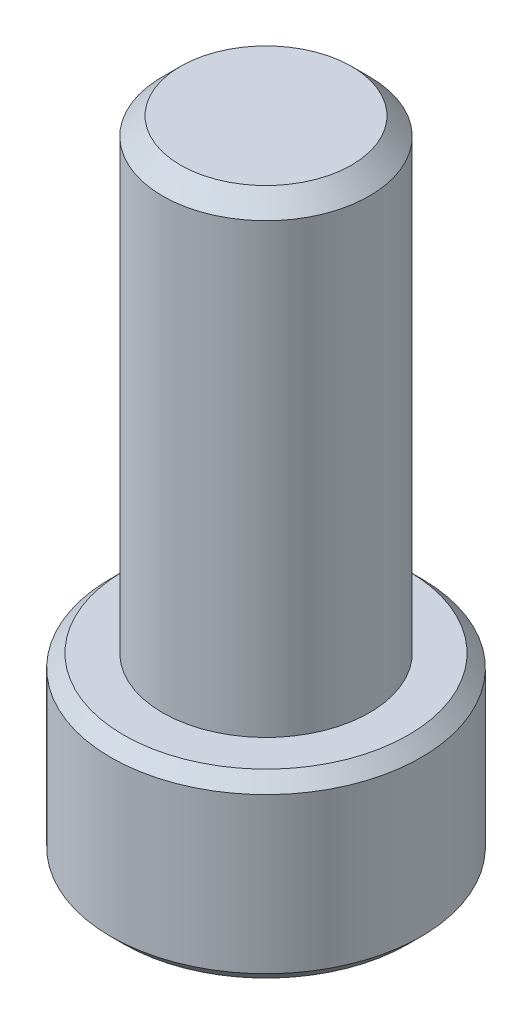
ISO-10303-21;
HEADER;
FILE_DESCRIPTION(('STEP AP214'),'2;1');
FILE_NAME('part.step','',(''),(''),'','','');
FILE_SCHEMA(('AUTOMOTIVE_DESIGN { 1 0 10303 214 1 1 1 1 }'));
ENDSEC;
DATA;
#1=APPLICATION_CONTEXT('core data for automotive mechanical design processes');
#2=APPLICATION_PROTOCOL_DEFINITION('international standard','automotive_design',2000,#1);
#3=PRODUCT_CONTEXT('',#1,'mechanical');
#4=PRODUCT('Part','Part','',(#3));
#5=PRODUCT_RELATED_PRODUCT_CATEGORY('part','',(#4));
#6=PRODUCT_DEFINITION_FORMATION('','',#4);
#7=PRODUCT_DEFINITION_CONTEXT('part definition',#1,'design');
#8=PRODUCT_DEFINITION('design','',#6,#7);
#9=PRODUCT_DEFINITION_SHAPE('','',#8);
#10=(LENGTH_UNIT() NAMED_UNIT(*) SI_UNIT(.MILLI.,.METRE.));
#11=(NAMED_UNIT(*) PLANE_ANGLE_UNIT() SI_UNIT($,.RADIAN.));
#12=(NAMED_UNIT(*) SI_UNIT($,.STERADIAN.) SOLID_ANGLE_UNIT());
#13=UNCERTAINTY_MEASURE_WITH_UNIT(LENGTH_MEASURE(1.E-05),#10,'distance_accuracy_value','');
#14=(GEOMETRIC_REPRESENTATION_CONTEXT(3) GLOBAL_UNCERTAINTY_ASSIGNED_CONTEXT((#13)) GLOBAL_UNIT_ASSIGNED_CONTEXT((#10,
#11,#12)) REPRESENTATION_CONTEXT('',''));
#15=CARTESIAN_POINT('',(0.,0.,0.));
#16=DIRECTION('',(0.,0.,1.));
#17=DIRECTION('',(1.,0.,0.));
#18=AXIS2_PLACEMENT_3D('',#15,#16,#17);
#19=CARTESIAN_POINT('',(0.,0.,0.));
#20=DIRECTION('',(0.,1.,0.));
#21=DIRECTION('',(0.,0.,1.));
#22=AXIS2_PLACEMENT_3D('',#19,#20,#21);
#23=PLANE('',#22);
#24=DIRECTION('',(0.,0.,-1.));
#25=VECTOR('',#24,1.);
#26=CARTESIAN_POINT('',(2.84807621135332,0.,-1.5));
#27=LINE('',#26,#25);
#28=CARTESIAN_POINT('',(2.84807621135332,0.,1.64433756729741));
#29=VERTEX_POINT('',#28);
#30=CARTESIAN_POINT('',(2.84807621135332,0.,-1.64433756729741));
#31=VERTEX_POINT('',#30);
#32=EDGE_CURVE('E234',#29,#31,#27,.T.);
#33=ORIENTED_EDGE('',*,*,#32,.T.);
#34=DIRECTION('',(-0.866025403784439,0.,-0.5));
#35=VECTOR('',#34,1.);
#36=CARTESIAN_POINT('',(0.125000000000001,0.,-3.21650635094611));
#37=LINE('',#36,#35);
#38=CARTESIAN_POINT('',(0.,0.,-3.28867513459481));
#39=VERTEX_POINT('',#38);
#40=EDGE_CURVE('E149',#31,#39,#37,.T.);
#41=ORIENTED_EDGE('',*,*,#40,.T.);
#42=DIRECTION('',(-0.866025403784439,0.,0.5));
#43=VECTOR('',#42,1.);
#44=CARTESIAN_POINT('',(-2.72307621135332,0.,-1.71650635094611));
#45=LINE('',#44,#43);
#46=CARTESIAN_POINT('',(-2.84807621135332,0.,-1.64433756729741));
#47=VERTEX_POINT('',#46);
#48=EDGE_CURVE('E178',#39,#47,#45,.T.);
#49=ORIENTED_EDGE('',*,*,#48,.T.);
#50=DIRECTION('',(0.,0.,1.));
#51=VECTOR('',#50,1.);
#52=CARTESIAN_POINT('',(-2.84807621135332,0.,1.5));
#53=LINE('',#52,#51);
#54=CARTESIAN_POINT('',(-2.84807621135332,0.,1.64433756729741));
#55=VERTEX_POINT('',#54);
#56=EDGE_CURVE('E225',#47,#55,#53,.T.);
#57=ORIENTED_EDGE('',*,*,#56,.T.);
#58=DIRECTION('',(0.866025403784439,0.,0.5));
#59=VECTOR('',#58,1.);
#60=CARTESIAN_POINT('',(-0.125000000000001,0.,3.21650635094611));
#61=LINE('',#60,#59);
#62=CARTESIAN_POINT('',(0.,0.,3.28867513459481));
#63=VERTEX_POINT('',#62);
#64=EDGE_CURVE('E228',#55,#63,#61,.T.);
#65=ORIENTED_EDGE('',*,*,#64,.T.);
#66=DIRECTION('',(0.866025403784439,0.,-0.5));
#67=VECTOR('',#66,1.);
#68=CARTESIAN_POINT('',(2.72307621135332,0.,1.71650635094611));
#69=LINE('',#68,#67);
#70=EDGE_CURVE('E231',#63,#29,#69,.T.);
#71=ORIENTED_EDGE('',*,*,#70,.T.);
#72=EDGE_LOOP('',(#33,#41,#49,#57,#65,#71));
#73=FACE_BOUND('',#72,.T.);
#74=CARTESIAN_POINT('',(0.,0.,0.));
#75=DIRECTION('',(0.,1.,0.));
#76=DIRECTION('',(0.,0.,1.));
#77=AXIS2_PLACEMENT_3D('',#74,#75,#76);
#78=CIRCLE('',#77,5.5);
#79=CARTESIAN_POINT('',(0.,0.,5.5));
#80=VERTEX_POINT('',#79);
#81=EDGE_CURVE('E217',#80,#80,#78,.F.);
#82=ORIENTED_EDGE('',*,*,#81,.T.);
#83=EDGE_LOOP('',(#82));
#84=FACE_BOUND('',#83,.T.);
#85=ADVANCED_FACE('F51',(#73,#84),#23,.F.);
#86=CARTESIAN_POINT('',(0.,25.,0.));
#87=DIRECTION('',(0.,-1.,0.));
#88=DIRECTION('',(0.,0.,-1.));
#89=AXIS2_PLACEMENT_3D('',#86,#87,#88);
#90=CYLINDRICAL_SURFACE('',#89,6.);
#91=CARTESIAN_POINT('',(0.,6.5,0.));
#92=DIRECTION('',(0.,-1.,0.));
#93=DIRECTION('',(0.,0.,-1.));
#94=AXIS2_PLACEMENT_3D('',#91,#92,#93);
#95=CIRCLE('',#94,6.);
#96=CARTESIAN_POINT('',(0.,6.5,-6.));
#97=VERTEX_POINT('',#96);
#98=EDGE_CURVE('E209',#97,#97,#95,.T.);
#99=ORIENTED_EDGE('',*,*,#98,.T.);
#100=EDGE_LOOP('',(#99));
#101=FACE_BOUND('',#100,.T.);
#102=CARTESIAN_POINT('',(0.,0.5,0.));
#103=DIRECTION('',(0.,1.,0.));
#104=DIRECTION('',(0.,0.,1.));
#105=AXIS2_PLACEMENT_3D('',#102,#103,#104);
#106=CIRCLE('',#105,6.);
#107=CARTESIAN_POINT('',(0.,0.5,6.));
#108=VERTEX_POINT('',#107);
#109=EDGE_CURVE('E205',#108,#108,#106,.T.);
#110=ORIENTED_EDGE('',*,*,#109,.T.);
#111=EDGE_LOOP('',(#110));
#112=FACE_BOUND('',#111,.T.);
#113=ADVANCED_FACE('F385',(#101,#112),#90,.T.);
#114=CARTESIAN_POINT('',(0.,25.,0.));
#115=DIRECTION('',(0.,-1.,0.));
#116=DIRECTION('',(0.,0.,-1.));
#117=AXIS2_PLACEMENT_3D('',#114,#115,#116);
#118=CYLINDRICAL_SURFACE('',#117,4.);
#119=CARTESIAN_POINT('',(0.,7.,0.));
#120=DIRECTION('',(0.,-1.,0.));
#121=DIRECTION('',(0.,0.,-1.));
#122=AXIS2_PLACEMENT_3D('',#119,#120,#121);
#123=CIRCLE('',#122,4.);
#124=CARTESIAN_POINT('',(0.,7.,-4.));
#125=VERTEX_POINT('',#124);
#126=EDGE_CURVE('E201',#125,#125,#123,.T.);
#127=ORIENTED_EDGE('',*,*,#126,.F.);
#128=EDGE_LOOP('',(#127));
#129=FACE_BOUND('',#128,.T.);
#130=CARTESIAN_POINT('',(0.,24.3095,0.));
#131=DIRECTION('',(0.,-1.,0.));
#132=DIRECTION('',(0.,0.,-1.));
#133=AXIS2_PLACEMENT_3D('',#130,#131,#132);
#134=CIRCLE('',#133,3.99999999999999);
#135=CARTESIAN_POINT('',(0.,24.3095,-3.99999999999999));
#136=VERTEX_POINT('',#135);
#137=EDGE_CURVE('E188',#136,#136,#134,.T.);
#138=ORIENTED_EDGE('',*,*,#137,.T.);
#139=EDGE_LOOP('',(#138));
#140=FACE_BOUND('',#139,.T.);
#141=ADVANCED_FACE('F392',(#129,#140),#118,.T.);
#142=CARTESIAN_POINT('',(4.,7.,0.));
#143=DIRECTION('',(0.,-1.,0.));
#144=DIRECTION('',(0.,0.,-1.));
#145=AXIS2_PLACEMENT_3D('',#142,#143,#144);
#146=PLANE('',#145);
#147=CARTESIAN_POINT('',(0.,7.,0.));
#148=DIRECTION('',(0.,-1.,0.));
#149=DIRECTION('',(0.,0.,-1.));
#150=AXIS2_PLACEMENT_3D('',#147,#148,#149);
#151=CIRCLE('',#150,5.5);
#152=CARTESIAN_POINT('',(0.,7.,-5.5));
#153=VERTEX_POINT('',#152);
#154=EDGE_CURVE('E213',#153,#153,#151,.F.);
#155=ORIENTED_EDGE('',*,*,#154,.T.);
#156=EDGE_LOOP('',(#155));
#157=FACE_BOUND('',#156,.T.);
#158=ORIENTED_EDGE('',*,*,#126,.T.);
#159=EDGE_LOOP('',(#158));
#160=FACE_BOUND('',#159,.T.);
#161=ADVANCED_FACE('F578',(#157,#160),#146,.F.);
#162=CARTESIAN_POINT('',(0.,25.,0.));
#163=DIRECTION('',(0.,-1.,0.));
#164=DIRECTION('',(0.,0.,-1.));
#165=AXIS2_PLACEMENT_3D('',#162,#163,#164);
#166=CONICAL_SURFACE('',#165,3.3095,0.785398163397455);
#167=ORIENTED_EDGE('',*,*,#137,.F.);
#168=EDGE_LOOP('',(#167));
#169=FACE_BOUND('',#168,.T.);
#170=CARTESIAN_POINT('',(0.,25.,0.));
#171=DIRECTION('',(0.,-1.,0.));
#172=DIRECTION('',(0.,0.,-1.));
#173=AXIS2_PLACEMENT_3D('',#170,#171,#172);
#174=CIRCLE('',#173,3.3095);
#175=CARTESIAN_POINT('',(0.,25.,-3.3095));
#176=VERTEX_POINT('',#175);
#177=EDGE_CURVE('E197',#176,#176,#174,.T.);
#178=ORIENTED_EDGE('',*,*,#177,.T.);
#179=EDGE_LOOP('',(#178));
#180=FACE_BOUND('',#179,.T.);
#181=ADVANCED_FACE('F572',(#169,#180),#166,.T.);
#182=CARTESIAN_POINT('',(0.,25.,0.));
#183=DIRECTION('',(0.,1.,0.));
#184=DIRECTION('',(0.,0.,1.));
#185=AXIS2_PLACEMENT_3D('',#182,#183,#184);
#186=PLANE('',#185);
#187=ORIENTED_EDGE('',*,*,#177,.F.);
#188=EDGE_LOOP('',(#187));
#189=FACE_BOUND('',#188,.T.);
#190=ADVANCED_FACE('F396',(#189),#186,.T.);
#191=CARTESIAN_POINT('',(0.,6.5,0.));
#192=DIRECTION('',(0.,-1.,0.));
#193=DIRECTION('',(0.,0.,-1.));
#194=AXIS2_PLACEMENT_3D('',#191,#192,#193);
#195=CONICAL_SURFACE('',#194,6.,0.785398163397447);
#196=ORIENTED_EDGE('',*,*,#154,.F.);
#197=EDGE_LOOP('',(#196));
#198=FACE_BOUND('',#197,.T.);
#199=ORIENTED_EDGE('',*,*,#98,.F.);
#200=EDGE_LOOP('',(#199));
#201=FACE_BOUND('',#200,.T.);
#202=ADVANCED_FACE('F400',(#198,#201),#195,.T.);
#203=CARTESIAN_POINT('',(0.,0.5,0.));
#204=DIRECTION('',(0.,1.,0.));
#205=DIRECTION('',(0.,0.,1.));
#206=AXIS2_PLACEMENT_3D('',#203,#204,#205);
#207=CONICAL_SURFACE('',#206,6.,0.78539816339745);
#208=ORIENTED_EDGE('',*,*,#81,.F.);
#209=EDGE_LOOP('',(#208));
#210=FACE_BOUND('',#209,.T.);
#211=ORIENTED_EDGE('',*,*,#109,.F.);
#212=EDGE_LOOP('',(#211));
#213=FACE_BOUND('',#212,.T.);
#214=ADVANCED_FACE('F406',(#210,#213),#207,.T.);
#215=CARTESIAN_POINT('',(-2.59807621135332,-1.2E-05,-1.5));
#216=DIRECTION('',(0.5,0.,0.866025403784439));
#217=DIRECTION('',(0.866025403784439,0.,-0.5));
#218=AXIS2_PLACEMENT_3D('',#215,#216,#217);
#219=PLANE('',#218);
#220=DIRECTION('',(0.,1.,0.));
#221=VECTOR('',#220,1.);
#222=CARTESIAN_POINT('',(-2.59807621135332,-1.2E-05,-1.5));
#223=LINE('',#222,#221);
#224=CARTESIAN_POINT('',(-2.59807621135332,0.25,-1.5));
#225=VERTEX_POINT('',#224);
#226=CARTESIAN_POINT('',(-2.59807621135332,2.25,-1.5));
#227=VERTEX_POINT('',#226);
#228=EDGE_CURVE('E294',#225,#227,#223,.T.);
#229=ORIENTED_EDGE('',*,*,#228,.F.);
#230=DIRECTION('',(0.866025403784439,0.,-0.5));
#231=VECTOR('',#230,1.);
#232=CARTESIAN_POINT('',(0.,0.25,-3.));
#233=LINE('',#232,#231);
#234=CARTESIAN_POINT('',(0.,0.25,-3.));
#235=VERTEX_POINT('',#234);
#236=EDGE_CURVE('E262',#225,#235,#233,.T.);
#237=ORIENTED_EDGE('',*,*,#236,.T.);
#238=DIRECTION('',(0.,1.,0.));
#239=VECTOR('',#238,1.);
#240=CARTESIAN_POINT('',(0.,-1.2E-05,-3.));
#241=LINE('',#240,#239);
#242=CARTESIAN_POINT('',(0.,2.25,-3.));
#243=VERTEX_POINT('',#242);
#244=EDGE_CURVE('E175',#235,#243,#241,.T.);
#245=ORIENTED_EDGE('',*,*,#244,.T.);
#246=DIRECTION('',(-0.866025403784439,0.,0.5));
#247=VECTOR('',#246,1.);
#248=CARTESIAN_POINT('',(-2.59807621135332,2.25,-1.5));
#249=LINE('',#248,#247);
#250=EDGE_CURVE('E259',#243,#227,#249,.T.);
#251=ORIENTED_EDGE('',*,*,#250,.T.);
#252=EDGE_LOOP('',(#229,#237,#245,#251));
#253=FACE_BOUND('',#252,.T.);
#254=ADVANCED_FACE('F327',(#253),#219,.T.);
#255=CARTESIAN_POINT('',(0.,-1.2E-05,-3.));
#256=DIRECTION('',(-0.5,0.,0.866025403784438));
#257=DIRECTION('',(0.866025403784438,0.,0.5));
#258=AXIS2_PLACEMENT_3D('',#255,#256,#257);
#259=PLANE('',#258);
#260=ORIENTED_EDGE('',*,*,#244,.F.);
#261=DIRECTION('',(0.866025403784438,0.,0.5));
#262=VECTOR('',#261,1.);
#263=CARTESIAN_POINT('',(2.59807621135332,0.25,-1.5));
#264=LINE('',#263,#262);
#265=CARTESIAN_POINT('',(2.59807621135332,0.25,-1.5));
#266=VERTEX_POINT('',#265);
#267=EDGE_CURVE('E147',#235,#266,#264,.T.);
#268=ORIENTED_EDGE('',*,*,#267,.T.);
#269=DIRECTION('',(0.,1.,0.));
#270=VECTOR('',#269,1.);
#271=CARTESIAN_POINT('',(2.59807621135332,-1.2E-05,-1.5));
#272=LINE('',#271,#270);
#273=CARTESIAN_POINT('',(2.59807621135332,2.25,-1.5));
#274=VERTEX_POINT('',#273);
#275=EDGE_CURVE('E172',#266,#274,#272,.T.);
#276=ORIENTED_EDGE('',*,*,#275,.T.);
#277=DIRECTION('',(-0.866025403784438,0.,-0.5));
#278=VECTOR('',#277,1.);
#279=CARTESIAN_POINT('',(0.,2.25,-3.));
#280=LINE('',#279,#278);
#281=EDGE_CURVE('E179',#274,#243,#280,.T.);
#282=ORIENTED_EDGE('',*,*,#281,.T.);
#283=EDGE_LOOP('',(#260,#268,#276,#282));
#284=FACE_BOUND('',#283,.T.);
#285=ADVANCED_FACE('F171',(#284),#259,.T.);
#286=CARTESIAN_POINT('',(2.59807621135332,-1.2E-05,-1.5));
#287=DIRECTION('',(-1.,0.,0.));
#288=DIRECTION('',(0.,0.,1.));
#289=AXIS2_PLACEMENT_3D('',#286,#287,#288);
#290=PLANE('',#289);
#291=ORIENTED_EDGE('',*,*,#275,.F.);
#292=DIRECTION('',(0.,0.,1.));
#293=VECTOR('',#292,1.);
#294=CARTESIAN_POINT('',(2.59807621135332,0.25,1.5));
#295=LINE('',#294,#293);
#296=CARTESIAN_POINT('',(2.59807621135332,0.25,1.5));
#297=VERTEX_POINT('',#296);
#298=EDGE_CURVE('E156',#266,#297,#295,.T.);
#299=ORIENTED_EDGE('',*,*,#298,.T.);
#300=DIRECTION('',(0.,1.,0.));
#301=VECTOR('',#300,1.);
#302=CARTESIAN_POINT('',(2.59807621135332,-1.2E-05,1.5));
#303=LINE('',#302,#301);
#304=CARTESIAN_POINT('',(2.59807621135332,2.25,1.5));
#305=VERTEX_POINT('',#304);
#306=EDGE_CURVE('E184',#297,#305,#303,.T.);
#307=ORIENTED_EDGE('',*,*,#306,.T.);
#308=DIRECTION('',(0.,0.,-1.));
#309=VECTOR('',#308,1.);
#310=CARTESIAN_POINT('',(2.59807621135332,2.25,-1.5));
#311=LINE('',#310,#309);
#312=EDGE_CURVE('E166',#305,#274,#311,.T.);
#313=ORIENTED_EDGE('',*,*,#312,.T.);
#314=EDGE_LOOP('',(#291,#299,#307,#313));
#315=FACE_BOUND('',#314,.T.);
#316=ADVANCED_FACE('F181',(#315),#290,.T.);
#317=CARTESIAN_POINT('',(2.59807621135332,-1.2E-05,1.5));
#318=DIRECTION('',(-0.5,0.,-0.866025403784439));
#319=DIRECTION('',(-0.866025403784439,0.,0.5));
#320=AXIS2_PLACEMENT_3D('',#317,#318,#319);
#321=PLANE('',#320);
#322=ORIENTED_EDGE('',*,*,#306,.F.);
#323=DIRECTION('',(-0.866025403784439,0.,0.5));
#324=VECTOR('',#323,1.);
#325=CARTESIAN_POINT('',(0.,0.25,3.));
#326=LINE('',#325,#324);
#327=CARTESIAN_POINT('',(0.,0.25,3.));
#328=VERTEX_POINT('',#327);
#329=EDGE_CURVE('E243',#297,#328,#326,.T.);
#330=ORIENTED_EDGE('',*,*,#329,.T.);
#331=DIRECTION('',(0.,1.,0.));
#332=VECTOR('',#331,1.);
#333=CARTESIAN_POINT('',(0.,-1.2E-05,3.));
#334=LINE('',#333,#332);
#335=CARTESIAN_POINT('',(0.,2.25,3.));
#336=VERTEX_POINT('',#335);
#337=EDGE_CURVE('E190',#328,#336,#334,.T.);
#338=ORIENTED_EDGE('',*,*,#337,.T.);
#339=DIRECTION('',(0.866025403784439,0.,-0.5));
#340=VECTOR('',#339,1.);
#341=CARTESIAN_POINT('',(2.59807621135332,2.25,1.5));
#342=LINE('',#341,#340);
#343=EDGE_CURVE('E165',#336,#305,#342,.T.);
#344=ORIENTED_EDGE('',*,*,#343,.T.);
#345=EDGE_LOOP('',(#322,#330,#338,#344));
#346=FACE_BOUND('',#345,.T.);
#347=ADVANCED_FACE('F346',(#346),#321,.T.);
#348=CARTESIAN_POINT('',(0.,-1.2E-05,3.));
#349=DIRECTION('',(0.5,0.,-0.866025403784439));
#350=DIRECTION('',(-0.866025403784439,0.,-0.5));
#351=AXIS2_PLACEMENT_3D('',#348,#349,#350);
#352=PLANE('',#351);
#353=ORIENTED_EDGE('',*,*,#337,.F.);
#354=DIRECTION('',(-0.866025403784439,0.,-0.5));
#355=VECTOR('',#354,1.);
#356=CARTESIAN_POINT('',(-2.59807621135332,0.25,1.5));
#357=LINE('',#356,#355);
#358=CARTESIAN_POINT('',(-2.59807621135332,0.25,1.5));
#359=VERTEX_POINT('',#358);
#360=EDGE_CURVE('E249',#328,#359,#357,.T.);
#361=ORIENTED_EDGE('',*,*,#360,.T.);
#362=DIRECTION('',(0.,1.,0.));
#363=VECTOR('',#362,1.);
#364=CARTESIAN_POINT('',(-2.59807621135332,-1.2E-05,1.5));
#365=LINE('',#364,#363);
#366=CARTESIAN_POINT('',(-2.59807621135332,2.25,1.5));
#367=VERTEX_POINT('',#366);
#368=EDGE_CURVE('E354',#359,#367,#365,.T.);
#369=ORIENTED_EDGE('',*,*,#368,.T.);
#370=DIRECTION('',(0.866025403784439,0.,0.5));
#371=VECTOR('',#370,1.);
#372=CARTESIAN_POINT('',(0.,2.25,3.));
#373=LINE('',#372,#371);
#374=EDGE_CURVE('E246',#367,#336,#373,.T.);
#375=ORIENTED_EDGE('',*,*,#374,.T.);
#376=EDGE_LOOP('',(#353,#361,#369,#375));
#377=FACE_BOUND('',#376,.T.);
#378=ADVANCED_FACE('F349',(#377),#352,.T.);
#379=CARTESIAN_POINT('',(-2.59807621135332,-1.2E-05,1.5));
#380=DIRECTION('',(1.,0.,0.));
#381=DIRECTION('',(0.,0.,-1.));
#382=AXIS2_PLACEMENT_3D('',#379,#380,#381);
#383=PLANE('',#382);
#384=ORIENTED_EDGE('',*,*,#368,.F.);
#385=DIRECTION('',(0.,0.,-1.));
#386=VECTOR('',#385,1.);
#387=CARTESIAN_POINT('',(-2.59807621135332,0.25,-1.5));
#388=LINE('',#387,#386);
#389=EDGE_CURVE('E256',#359,#225,#388,.T.);
#390=ORIENTED_EDGE('',*,*,#389,.T.);
#391=ORIENTED_EDGE('',*,*,#228,.T.);
#392=DIRECTION('',(0.,0.,1.));
#393=VECTOR('',#392,1.);
#394=CARTESIAN_POINT('',(-2.59807621135332,2.25,1.5));
#395=LINE('',#394,#393);
#396=EDGE_CURVE('E252',#227,#367,#395,.T.);
#397=ORIENTED_EDGE('',*,*,#396,.T.);
#398=EDGE_LOOP('',(#384,#390,#391,#397));
#399=FACE_BOUND('',#398,.T.);
#400=ADVANCED_FACE('F362',(#399),#383,.T.);
#401=CARTESIAN_POINT('',(0.,2.5,0.));
#402=DIRECTION('',(0.,-1.,0.));
#403=DIRECTION('',(0.,0.,-1.));
#404=AXIS2_PLACEMENT_3D('',#401,#402,#403);
#405=PLANE('',#404);
#406=DIRECTION('',(-0.866025403784439,0.,-0.5));
#407=VECTOR('',#406,1.);
#408=CARTESIAN_POINT('',(-2.47307621135331,2.5,1.28349364905389));
#409=LINE('',#408,#407);
#410=CARTESIAN_POINT('',(0.,2.5,2.71132486540518));
#411=VERTEX_POINT('',#410);
#412=CARTESIAN_POINT('',(-2.34807621135331,2.5,1.35566243270259));
#413=VERTEX_POINT('',#412);
#414=EDGE_CURVE('E62',#411,#413,#409,.T.);
#415=ORIENTED_EDGE('',*,*,#414,.T.);
#416=DIRECTION('',(0.,0.,-1.));
#417=VECTOR('',#416,1.);
#418=CARTESIAN_POINT('',(-2.34807621135331,2.5,-1.5));
#419=LINE('',#418,#417);
#420=CARTESIAN_POINT('',(-2.34807621135331,2.5,-1.35566243270259));
#421=VERTEX_POINT('',#420);
#422=EDGE_CURVE('E11',#413,#421,#419,.T.);
#423=ORIENTED_EDGE('',*,*,#422,.T.);
#424=DIRECTION('',(0.866025403784439,0.,-0.5));
#425=VECTOR('',#424,1.);
#426=CARTESIAN_POINT('',(0.125000000000003,2.5,-2.78349364905389));
#427=LINE('',#426,#425);
#428=CARTESIAN_POINT('',(0.,2.5,-2.71132486540518));
#429=VERTEX_POINT('',#428);
#430=EDGE_CURVE('E265',#421,#429,#427,.T.);
#431=ORIENTED_EDGE('',*,*,#430,.T.);
#432=DIRECTION('',(0.866025403784439,0.,0.5));
#433=VECTOR('',#432,1.);
#434=CARTESIAN_POINT('',(2.47307621135331,2.5,-1.28349364905389));
#435=LINE('',#434,#433);
#436=CARTESIAN_POINT('',(2.34807621135331,2.5,-1.35566243270259));
#437=VERTEX_POINT('',#436);
#438=EDGE_CURVE('E268',#429,#437,#435,.T.);
#439=ORIENTED_EDGE('',*,*,#438,.T.);
#440=DIRECTION('',(0.,0.,1.));
#441=VECTOR('',#440,1.);
#442=CARTESIAN_POINT('',(2.34807621135331,2.5,1.5));
#443=LINE('',#442,#441);
#444=CARTESIAN_POINT('',(2.34807621135331,2.5,1.35566243270259));
#445=VERTEX_POINT('',#444);
#446=EDGE_CURVE('E271',#437,#445,#443,.T.);
#447=ORIENTED_EDGE('',*,*,#446,.T.);
#448=DIRECTION('',(-0.866025403784439,0.,0.5));
#449=VECTOR('',#448,1.);
#450=CARTESIAN_POINT('',(-0.125000000000002,2.5,2.78349364905389));
#451=LINE('',#450,#449);
#452=EDGE_CURVE('E73',#445,#411,#451,.T.);
#453=ORIENTED_EDGE('',*,*,#452,.T.);
#454=EDGE_LOOP('',(#415,#423,#431,#439,#447,#453));
#455=FACE_BOUND('',#454,.T.);
#456=ADVANCED_FACE('F375',(#455),#405,.T.);
#457=CARTESIAN_POINT('',(0.,0.25,3.));
#458=DIRECTION('',(0.353553390593273,-0.70710678118655,-0.612372435695792));
#459=DIRECTION('',(0.866025403784439,0.,0.5));
#460=AXIS2_PLACEMENT_3D('',#457,#458,#459);
#461=PLANE('',#460);
#462=DIRECTION('',(0.,-0.654653670707975,0.755928946018456));
#463=VECTOR('',#462,1.);
#464=CARTESIAN_POINT('',(0.,0.992307488958093,2.14285714285714));
#465=LINE('',#464,#463);
#466=EDGE_CURVE('E286',#63,#328,#465,.F.);
#467=ORIENTED_EDGE('',*,*,#466,.F.);
#468=ORIENTED_EDGE('',*,*,#64,.F.);
#469=DIRECTION('',(-0.654653670707978,-0.654653670707975,0.37796447300923));
#470=VECTOR('',#469,1.);
#471=CARTESIAN_POINT('',(-1.85576872239523,0.992307488958087,1.07142857142857));
#472=LINE('',#471,#470);
#473=EDGE_CURVE('E290',#359,#55,#472,.T.);
#474=ORIENTED_EDGE('',*,*,#473,.F.);
#475=ORIENTED_EDGE('',*,*,#360,.F.);
#476=EDGE_LOOP('',(#467,#468,#474,#475));
#477=FACE_BOUND('',#476,.T.);
#478=ADVANCED_FACE('F357',(#477),#461,.T.);
#479=CARTESIAN_POINT('',(-2.59807621135332,0.25,1.5));
#480=DIRECTION('',(0.707106781186546,-0.707106781186549,0.));
#481=DIRECTION('',(0.,0.,1.));
#482=AXIS2_PLACEMENT_3D('',#479,#480,#481);
#483=PLANE('',#482);
#484=ORIENTED_EDGE('',*,*,#473,.T.);
#485=ORIENTED_EDGE('',*,*,#56,.F.);
#486=DIRECTION('',(-0.654653670707978,-0.654653670707976,-0.377964473009229));
#487=VECTOR('',#486,1.);
#488=CARTESIAN_POINT('',(-1.85576872239522,0.992307488958091,-1.07142857142857));
#489=LINE('',#488,#487);
#490=EDGE_CURVE('E282',#225,#47,#489,.T.);
#491=ORIENTED_EDGE('',*,*,#490,.F.);
#492=ORIENTED_EDGE('',*,*,#389,.F.);
#493=EDGE_LOOP('',(#484,#485,#491,#492));
#494=FACE_BOUND('',#493,.T.);
#495=ADVANCED_FACE('F360',(#494),#483,.T.);
#496=CARTESIAN_POINT('',(2.59807621135332,0.25,1.5));
#497=DIRECTION('',(-0.353553390593273,-0.707106781186549,-0.612372435695793));
#498=DIRECTION('',(0.866025403784439,0.,-0.5));
#499=AXIS2_PLACEMENT_3D('',#496,#497,#498);
#500=PLANE('',#499);
#501=ORIENTED_EDGE('',*,*,#466,.T.);
#502=ORIENTED_EDGE('',*,*,#329,.F.);
#503=DIRECTION('',(0.654653670707978,-0.654653670707976,0.377964473009228));
#504=VECTOR('',#503,1.);
#505=CARTESIAN_POINT('',(1.85576872239522,0.992307488958091,1.07142857142857));
#506=LINE('',#505,#504);
#507=EDGE_CURVE('E159',#29,#297,#506,.F.);
#508=ORIENTED_EDGE('',*,*,#507,.F.);
#509=ORIENTED_EDGE('',*,*,#70,.F.);
#510=EDGE_LOOP('',(#501,#502,#508,#509));
#511=FACE_BOUND('',#510,.T.);
#512=ADVANCED_FACE('F342',(#511),#500,.T.);
#513=CARTESIAN_POINT('',(-2.59807621135332,0.25,-1.5));
#514=DIRECTION('',(0.353553390593273,-0.707106781186549,0.612372435695793));
#515=DIRECTION('',(-0.866025403784439,0.,0.5));
#516=AXIS2_PLACEMENT_3D('',#513,#514,#515);
#517=PLANE('',#516);
#518=ORIENTED_EDGE('',*,*,#490,.T.);
#519=ORIENTED_EDGE('',*,*,#48,.F.);
#520=DIRECTION('',(0.,0.654653670707976,0.755928946018456));
#521=VECTOR('',#520,1.);
#522=CARTESIAN_POINT('',(0.,0.25,-3.));
#523=LINE('',#522,#521);
#524=EDGE_CURVE('E153',#235,#39,#523,.F.);
#525=ORIENTED_EDGE('',*,*,#524,.F.);
#526=ORIENTED_EDGE('',*,*,#236,.F.);
#527=EDGE_LOOP('',(#518,#519,#525,#526));
#528=FACE_BOUND('',#527,.T.);
#529=ADVANCED_FACE('F332',(#528),#517,.T.);
#530=CARTESIAN_POINT('',(2.59807621135332,0.25,-1.5));
#531=DIRECTION('',(-0.707106781186547,-0.707106781186549,0.));
#532=DIRECTION('',(0.,0.,-1.));
#533=AXIS2_PLACEMENT_3D('',#530,#531,#532);
#534=PLANE('',#533);
#535=ORIENTED_EDGE('',*,*,#507,.T.);
#536=ORIENTED_EDGE('',*,*,#298,.F.);
#537=DIRECTION('',(0.654653670707978,-0.654653670707976,-0.377964473009227));
#538=VECTOR('',#537,1.);
#539=CARTESIAN_POINT('',(1.85576872239522,0.99230748895809,-1.07142857142857));
#540=LINE('',#539,#538);
#541=EDGE_CURVE('E143',#31,#266,#540,.F.);
#542=ORIENTED_EDGE('',*,*,#541,.F.);
#543=ORIENTED_EDGE('',*,*,#32,.F.);
#544=EDGE_LOOP('',(#535,#536,#542,#543));
#545=FACE_BOUND('',#544,.T.);
#546=ADVANCED_FACE('F157',(#545),#534,.T.);
#547=CARTESIAN_POINT('',(0.,0.25,-3.));
#548=DIRECTION('',(-0.353553390593274,-0.707106781186548,0.612372435695794));
#549=DIRECTION('',(-0.866025403784438,0.,-0.5));
#550=AXIS2_PLACEMENT_3D('',#547,#548,#549);
#551=PLANE('',#550);
#552=ORIENTED_EDGE('',*,*,#524,.T.);
#553=ORIENTED_EDGE('',*,*,#40,.F.);
#554=ORIENTED_EDGE('',*,*,#541,.T.);
#555=ORIENTED_EDGE('',*,*,#267,.F.);
#556=EDGE_LOOP('',(#552,#553,#554,#555));
#557=FACE_BOUND('',#556,.T.);
#558=ADVANCED_FACE('F145',(#557),#551,.T.);
#559=CARTESIAN_POINT('',(2.34807621135331,2.5,0.));
#560=DIRECTION('',(-0.707106781186546,-0.707106781186549,0.));
#561=DIRECTION('',(0.,0.,-1.));
#562=AXIS2_PLACEMENT_3D('',#559,#560,#561);
#563=PLANE('',#562);
#564=DIRECTION('',(-0.654653670707979,0.654653670707976,0.377964473009227));
#565=VECTOR('',#564,1.);
#566=CARTESIAN_POINT('',(2.01263675258855,2.83543945876476,-1.16199637088793));
#567=LINE('',#566,#565);
#568=EDGE_CURVE('E308',#274,#437,#567,.T.);
#569=ORIENTED_EDGE('',*,*,#568,.F.);
#570=ORIENTED_EDGE('',*,*,#312,.F.);
#571=DIRECTION('',(-0.654653670707979,0.654653670707976,-0.377964473009228));
#572=VECTOR('',#571,1.);
#573=CARTESIAN_POINT('',(2.01263675258855,2.83543945876476,1.16199637088794));
#574=LINE('',#573,#572);
#575=EDGE_CURVE('E56',#445,#305,#574,.F.);
#576=ORIENTED_EDGE('',*,*,#575,.F.);
#577=ORIENTED_EDGE('',*,*,#446,.F.);
#578=EDGE_LOOP('',(#569,#570,#576,#577));
#579=FACE_BOUND('',#578,.T.);
#580=ADVANCED_FACE('F54',(#579),#563,.T.);
#581=CARTESIAN_POINT('',(1.17403810567666,2.5,2.03349364905389));
#582=DIRECTION('',(-0.353553390593273,-0.707106781186549,-0.612372435695793));
#583=DIRECTION('',(0.866025403784439,0.,-0.5));
#584=AXIS2_PLACEMENT_3D('',#581,#582,#583);
#585=PLANE('',#584);
#586=ORIENTED_EDGE('',*,*,#575,.T.);
#587=ORIENTED_EDGE('',*,*,#343,.F.);
#588=DIRECTION('',(0.,0.654653670707976,-0.755928946018456));
#589=VECTOR('',#588,1.);
#590=CARTESIAN_POINT('',(0.,2.83543945876476,2.32399274177587));
#591=LINE('',#590,#589);
#592=EDGE_CURVE('E305',#411,#336,#591,.F.);
#593=ORIENTED_EDGE('',*,*,#592,.F.);
#594=ORIENTED_EDGE('',*,*,#452,.F.);
#595=EDGE_LOOP('',(#586,#587,#593,#594));
#596=FACE_BOUND('',#595,.T.);
#597=ADVANCED_FACE('F319',(#596),#585,.T.);
#598=CARTESIAN_POINT('',(1.17403810567666,2.5,-2.03349364905389));
#599=DIRECTION('',(-0.353553390593273,-0.707106781186549,0.612372435695793));
#600=DIRECTION('',(-0.866025403784438,0.,-0.5));
#601=AXIS2_PLACEMENT_3D('',#598,#599,#600);
#602=PLANE('',#601);
#603=ORIENTED_EDGE('',*,*,#568,.T.);
#604=ORIENTED_EDGE('',*,*,#438,.F.);
#605=DIRECTION('',(0.,0.654653670707976,0.755928946018456));
#606=VECTOR('',#605,1.);
#607=CARTESIAN_POINT('',(0.,2.83543945876476,-2.32399274177587));
#608=LINE('',#607,#606);
#609=EDGE_CURVE('E301',#243,#429,#608,.T.);
#610=ORIENTED_EDGE('',*,*,#609,.F.);
#611=ORIENTED_EDGE('',*,*,#281,.F.);
#612=EDGE_LOOP('',(#603,#604,#610,#611));
#613=FACE_BOUND('',#612,.T.);
#614=ADVANCED_FACE('F323',(#613),#602,.T.);
#615=CARTESIAN_POINT('',(-1.17403810567666,2.5,2.03349364905389));
#616=DIRECTION('',(0.353553390593273,-0.707106781186549,-0.612372435695793));
#617=DIRECTION('',(0.866025403784439,0.,0.5));
#618=AXIS2_PLACEMENT_3D('',#615,#616,#617);
#619=PLANE('',#618);
#620=ORIENTED_EDGE('',*,*,#592,.T.);
#621=ORIENTED_EDGE('',*,*,#374,.F.);
#622=DIRECTION('',(0.654653670707979,0.654653670707976,-0.377964473009227));
#623=VECTOR('',#622,1.);
#624=CARTESIAN_POINT('',(-2.01263675258855,2.83543945876476,1.16199637088793));
#625=LINE('',#624,#623);
#626=EDGE_CURVE('E298',#413,#367,#625,.F.);
#627=ORIENTED_EDGE('',*,*,#626,.F.);
#628=ORIENTED_EDGE('',*,*,#414,.F.);
#629=EDGE_LOOP('',(#620,#621,#627,#628));
#630=FACE_BOUND('',#629,.T.);
#631=ADVANCED_FACE('F451',(#630),#619,.T.);
#632=CARTESIAN_POINT('',(-1.17403810567666,2.5,-2.03349364905389));
#633=DIRECTION('',(0.353553390593273,-0.707106781186549,0.612372435695794));
#634=DIRECTION('',(-0.866025403784439,0.,0.5));
#635=AXIS2_PLACEMENT_3D('',#632,#633,#634);
#636=PLANE('',#635);
#637=ORIENTED_EDGE('',*,*,#609,.T.);
#638=ORIENTED_EDGE('',*,*,#430,.F.);
#639=DIRECTION('',(-0.654653670707979,-0.654653670707976,-0.377964473009227));
#640=VECTOR('',#639,1.);
#641=CARTESIAN_POINT('',(-2.01263675258855,2.83543945876476,-1.16199637088794));
#642=LINE('',#641,#640);
#643=EDGE_CURVE('E295',#227,#421,#642,.F.);
#644=ORIENTED_EDGE('',*,*,#643,.F.);
#645=ORIENTED_EDGE('',*,*,#250,.F.);
#646=EDGE_LOOP('',(#637,#638,#644,#645));
#647=FACE_BOUND('',#646,.T.);
#648=ADVANCED_FACE('F374',(#647),#636,.T.);
#649=CARTESIAN_POINT('',(-2.34807621135331,2.5,0.));
#650=DIRECTION('',(0.707106781186546,-0.707106781186549,0.));
#651=DIRECTION('',(0.,0.,1.));
#652=AXIS2_PLACEMENT_3D('',#649,#650,#651);
#653=PLANE('',#652);
#654=ORIENTED_EDGE('',*,*,#626,.T.);
#655=ORIENTED_EDGE('',*,*,#396,.F.);
#656=ORIENTED_EDGE('',*,*,#643,.T.);
#657=ORIENTED_EDGE('',*,*,#422,.F.);
#658=EDGE_LOOP('',(#654,#655,#656,#657));
#659=FACE_BOUND('',#658,.T.);
#660=ADVANCED_FACE('F370',(#659),#653,.T.);
#661=CLOSED_SHELL('',(#85,#113,#141,#161,#181,#190,#202,#214,#254,#285,#316,#347,#378,#400,#456,
#478,#495,#512,#529,#546,#558,#580,#597,#614,#631,#648,#660));
#662=MANIFOLD_SOLID_BREP('B2',#661);
#663=ADVANCED_BREP_SHAPE_REPRESENTATION('',(#18,#662),#14);
#664=SHAPE_DEFINITION_REPRESENTATION(#9,#663);
ENDSEC;
END-ISO-10303-21;
